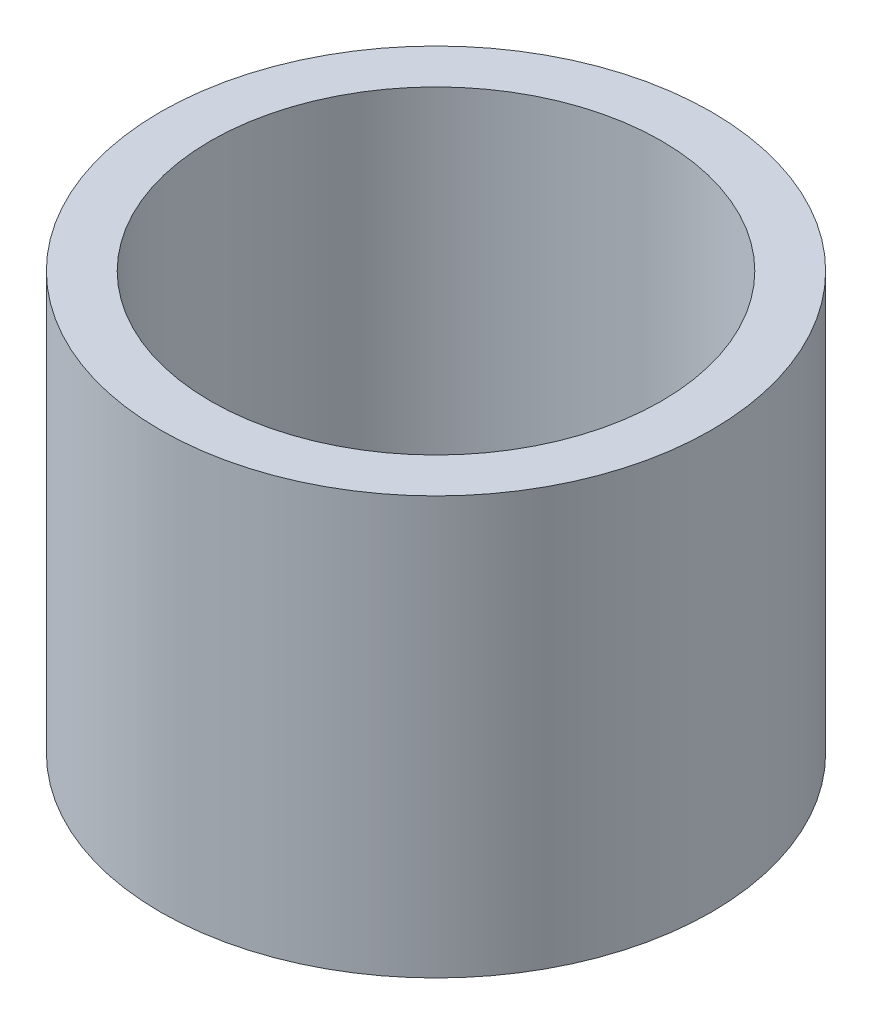
ISO-10303-21;
HEADER;
FILE_DESCRIPTION(('STEP AP214'),'2;1');
FILE_NAME('part.step','',(''),(''),'','','');
FILE_SCHEMA(('AUTOMOTIVE_DESIGN { 1 0 10303 214 1 1 1 1 }'));
ENDSEC;
DATA;
#1=APPLICATION_CONTEXT('core data for automotive mechanical design processes');
#2=APPLICATION_PROTOCOL_DEFINITION('international standard','automotive_design',2000,#1);
#3=PRODUCT_CONTEXT('',#1,'mechanical');
#4=PRODUCT('Part','Part','',(#3));
#5=PRODUCT_RELATED_PRODUCT_CATEGORY('part','',(#4));
#6=PRODUCT_DEFINITION_FORMATION('','',#4);
#7=PRODUCT_DEFINITION_CONTEXT('part definition',#1,'design');
#8=PRODUCT_DEFINITION('design','',#6,#7);
#9=PRODUCT_DEFINITION_SHAPE('','',#8);
#10=(LENGTH_UNIT() NAMED_UNIT(*) SI_UNIT(.MILLI.,.METRE.));
#11=(NAMED_UNIT(*) PLANE_ANGLE_UNIT() SI_UNIT($,.RADIAN.));
#12=(NAMED_UNIT(*) SI_UNIT($,.STERADIAN.) SOLID_ANGLE_UNIT());
#13=UNCERTAINTY_MEASURE_WITH_UNIT(LENGTH_MEASURE(1.E-05),#10,'distance_accuracy_value','');
#14=(GEOMETRIC_REPRESENTATION_CONTEXT(3) GLOBAL_UNCERTAINTY_ASSIGNED_CONTEXT((#13)) GLOBAL_UNIT_ASSIGNED_CONTEXT((#10,
#11,#12)) REPRESENTATION_CONTEXT('',''));
#15=CARTESIAN_POINT('',(0.,0.,0.));
#16=DIRECTION('',(0.,0.,1.));
#17=DIRECTION('',(1.,0.,0.));
#18=AXIS2_PLACEMENT_3D('',#15,#16,#17);
#19=CARTESIAN_POINT('',(0.,25.,0.));
#20=DIRECTION('',(0.,1.,0.));
#21=DIRECTION('',(0.,0.,1.));
#22=AXIS2_PLACEMENT_3D('',#19,#20,#21);
#23=PLANE('',#22);
#24=CARTESIAN_POINT('',(0.,25.,0.));
#25=DIRECTION('',(0.,1.,0.));
#26=DIRECTION('',(0.,0.,1.));
#27=AXIS2_PLACEMENT_3D('',#24,#25,#26);
#28=CIRCLE('',#27,16.5);
#29=CARTESIAN_POINT('',(0.,25.,16.5));
#30=VERTEX_POINT('',#29);
#31=EDGE_CURVE('E10',#30,#30,#28,.T.);
#32=ORIENTED_EDGE('',*,*,#31,.T.);
#33=EDGE_LOOP('',(#32));
#34=FACE_BOUND('',#33,.T.);
#35=CARTESIAN_POINT('',(0.,25.,0.));
#36=DIRECTION('',(0.,1.,0.));
#37=DIRECTION('',(0.,0.,1.));
#38=AXIS2_PLACEMENT_3D('',#35,#36,#37);
#39=CIRCLE('',#38,13.5);
#40=CARTESIAN_POINT('',(0.,25.,13.5));
#41=VERTEX_POINT('',#40);
#42=EDGE_CURVE('E42',#41,#41,#39,.T.);
#43=ORIENTED_EDGE('',*,*,#42,.F.);
#44=EDGE_LOOP('',(#43));
#45=FACE_BOUND('',#44,.T.);
#46=ADVANCED_FACE('F31',(#34,#45),#23,.T.);
#47=CARTESIAN_POINT('',(0.,0.,0.));
#48=DIRECTION('',(0.,1.,0.));
#49=DIRECTION('',(0.,0.,1.));
#50=AXIS2_PLACEMENT_3D('',#47,#48,#49);
#51=PLANE('',#50);
#52=CARTESIAN_POINT('',(0.,0.,0.));
#53=DIRECTION('',(0.,1.,0.));
#54=DIRECTION('',(0.,0.,1.));
#55=AXIS2_PLACEMENT_3D('',#52,#53,#54);
#56=CIRCLE('',#55,16.5);
#57=CARTESIAN_POINT('',(0.,0.,16.5));
#58=VERTEX_POINT('',#57);
#59=EDGE_CURVE('E35',#58,#58,#56,.T.);
#60=ORIENTED_EDGE('',*,*,#59,.F.);
#61=EDGE_LOOP('',(#60));
#62=FACE_BOUND('',#61,.T.);
#63=CARTESIAN_POINT('',(0.,0.,0.));
#64=DIRECTION('',(0.,1.,0.));
#65=DIRECTION('',(0.,0.,1.));
#66=AXIS2_PLACEMENT_3D('',#63,#64,#65);
#67=CIRCLE('',#66,13.5);
#68=CARTESIAN_POINT('',(0.,0.,13.5));
#69=VERTEX_POINT('',#68);
#70=EDGE_CURVE('E44',#69,#69,#67,.T.);
#71=ORIENTED_EDGE('',*,*,#70,.T.);
#72=EDGE_LOOP('',(#71));
#73=FACE_BOUND('',#72,.T.);
#74=ADVANCED_FACE('F54',(#62,#73),#51,.F.);
#75=CARTESIAN_POINT('',(0.,25.,0.));
#76=DIRECTION('',(0.,-1.,0.));
#77=DIRECTION('',(0.,0.,-1.));
#78=AXIS2_PLACEMENT_3D('',#75,#76,#77);
#79=CYLINDRICAL_SURFACE('',#78,16.5);
#80=ORIENTED_EDGE('',*,*,#31,.F.);
#81=EDGE_LOOP('',(#80));
#82=FACE_BOUND('',#81,.T.);
#83=ORIENTED_EDGE('',*,*,#59,.T.);
#84=EDGE_LOOP('',(#83));
#85=FACE_BOUND('',#84,.T.);
#86=ADVANCED_FACE('F33',(#82,#85),#79,.T.);
#87=CARTESIAN_POINT('',(0.,25.,0.));
#88=DIRECTION('',(0.,-1.,0.));
#89=DIRECTION('',(0.,0.,-1.));
#90=AXIS2_PLACEMENT_3D('',#87,#88,#89);
#91=CYLINDRICAL_SURFACE('',#90,13.5);
#92=ORIENTED_EDGE('',*,*,#42,.T.);
#93=EDGE_LOOP('',(#92));
#94=FACE_BOUND('',#93,.T.);
#95=ORIENTED_EDGE('',*,*,#70,.F.);
#96=EDGE_LOOP('',(#95));
#97=FACE_BOUND('',#96,.T.);
#98=ADVANCED_FACE('F50',(#94,#97),#91,.F.);
#99=CLOSED_SHELL('',(#46,#74,#86,#98));
#100=MANIFOLD_SOLID_BREP('B2',#99);
#101=ADVANCED_BREP_SHAPE_REPRESENTATION('',(#18,#100),#14);
#102=SHAPE_DEFINITION_REPRESENTATION(#9,#101);
ENDSEC;
END-ISO-10303-21;
